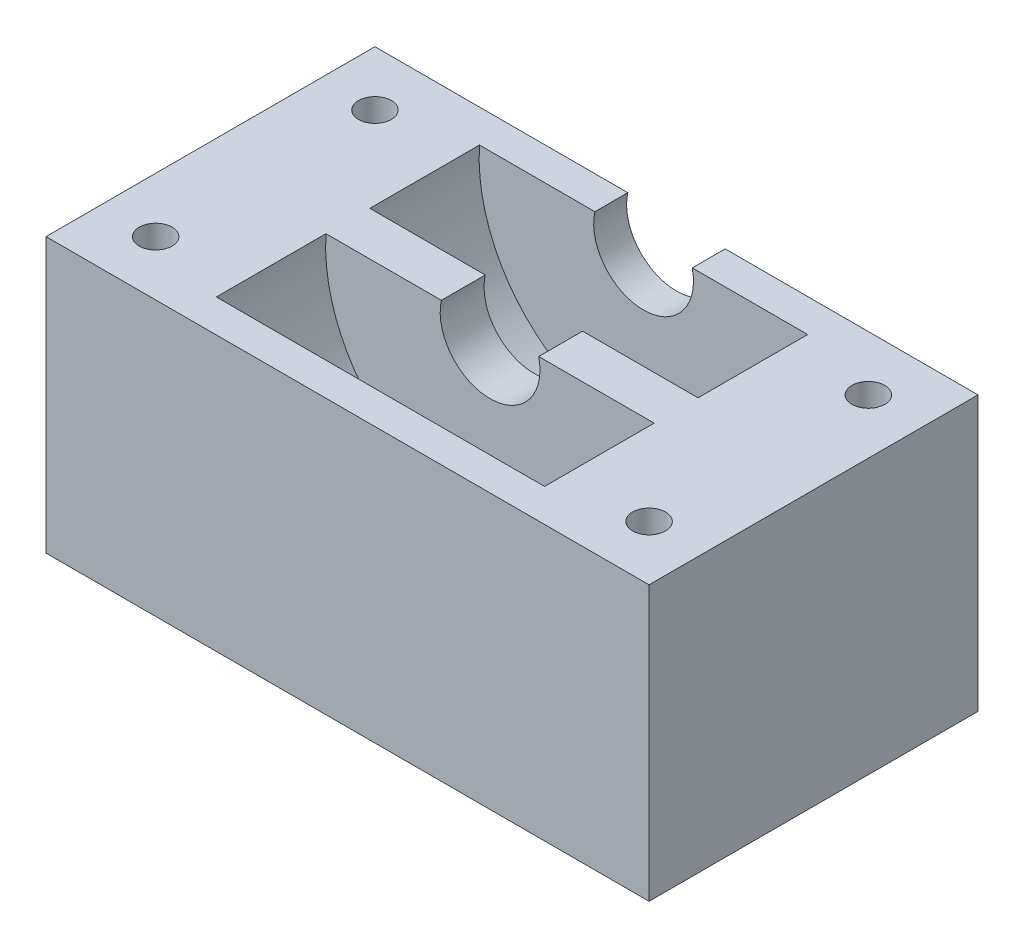
ISO-10303-21;
HEADER;
FILE_DESCRIPTION(('STEP AP214'),'2;1');
FILE_NAME('part.step','',(''),(''),'','','');
FILE_SCHEMA(('AUTOMOTIVE_DESIGN { 1 0 10303 214 1 1 1 1 }'));
ENDSEC;
DATA;
#1=APPLICATION_CONTEXT('core data for automotive mechanical design processes');
#2=APPLICATION_PROTOCOL_DEFINITION('international standard','automotive_design',2000,#1);
#3=PRODUCT_CONTEXT('',#1,'mechanical');
#4=PRODUCT('Part','Part','',(#3));
#5=PRODUCT_RELATED_PRODUCT_CATEGORY('part','',(#4));
#6=PRODUCT_DEFINITION_FORMATION('','',#4);
#7=PRODUCT_DEFINITION_CONTEXT('part definition',#1,'design');
#8=PRODUCT_DEFINITION('design','',#6,#7);
#9=PRODUCT_DEFINITION_SHAPE('','',#8);
#10=(LENGTH_UNIT() NAMED_UNIT(*) SI_UNIT(.MILLI.,.METRE.));
#11=(NAMED_UNIT(*) PLANE_ANGLE_UNIT() SI_UNIT($,.RADIAN.));
#12=(NAMED_UNIT(*) SI_UNIT($,.STERADIAN.) SOLID_ANGLE_UNIT());
#13=UNCERTAINTY_MEASURE_WITH_UNIT(LENGTH_MEASURE(1.E-05),#10,'distance_accuracy_value','');
#14=(GEOMETRIC_REPRESENTATION_CONTEXT(3) GLOBAL_UNCERTAINTY_ASSIGNED_CONTEXT((#13)) GLOBAL_UNIT_ASSIGNED_CONTEXT((#10,
#11,#12)) REPRESENTATION_CONTEXT('',''));
#15=CARTESIAN_POINT('',(0.,0.,0.));
#16=DIRECTION('',(0.,0.,1.));
#17=DIRECTION('',(1.,0.,0.));
#18=AXIS2_PLACEMENT_3D('',#15,#16,#17);
#19=CARTESIAN_POINT('',(-22.5,-17.5,-15.));
#20=DIRECTION('',(0.,1.,0.));
#21=DIRECTION('',(0.,0.,1.));
#22=AXIS2_PLACEMENT_3D('',#19,#20,#21);
#23=CYLINDRICAL_SURFACE('',#22,1.5);
#24=CARTESIAN_POINT('',(-22.5,0.999999999999994,-15.));
#25=DIRECTION('',(0.,-1.,0.));
#26=DIRECTION('',(0.,0.,-1.));
#27=AXIS2_PLACEMENT_3D('',#24,#25,#26);
#28=CIRCLE('',#27,1.5);
#29=CARTESIAN_POINT('',(-22.5,0.999999999999994,-16.5));
#30=VERTEX_POINT('',#29);
#31=EDGE_CURVE('E310',#30,#30,#28,.F.);
#32=ORIENTED_EDGE('',*,*,#31,.T.);
#33=EDGE_LOOP('',(#32));
#34=FACE_BOUND('',#33,.T.);
#35=CARTESIAN_POINT('',(-22.5,-4.,-15.));
#36=DIRECTION('',(0.,-1.,0.));
#37=DIRECTION('',(0.,0.,-1.));
#38=AXIS2_PLACEMENT_3D('',#35,#36,#37);
#39=CIRCLE('',#38,1.5);
#40=CARTESIAN_POINT('',(-22.5,-4.,-16.5));
#41=VERTEX_POINT('',#40);
#42=EDGE_CURVE('E73',#41,#41,#39,.F.);
#43=ORIENTED_EDGE('',*,*,#42,.F.);
#44=EDGE_LOOP('',(#43));
#45=FACE_BOUND('',#44,.T.);
#46=ADVANCED_FACE('F69',(#34,#45),#23,.F.);
#47=CARTESIAN_POINT('',(-22.5,-17.5,5.));
#48=DIRECTION('',(0.,1.,0.));
#49=DIRECTION('',(0.,0.,1.));
#50=AXIS2_PLACEMENT_3D('',#47,#48,#49);
#51=CYLINDRICAL_SURFACE('',#50,1.5);
#52=CARTESIAN_POINT('',(-22.5,0.999999999999994,5.));
#53=DIRECTION('',(0.,-1.,0.));
#54=DIRECTION('',(0.,0.,-1.));
#55=AXIS2_PLACEMENT_3D('',#52,#53,#54);
#56=CIRCLE('',#55,1.5);
#57=CARTESIAN_POINT('',(-22.5,0.999999999999994,3.5));
#58=VERTEX_POINT('',#57);
#59=EDGE_CURVE('E306',#58,#58,#56,.F.);
#60=ORIENTED_EDGE('',*,*,#59,.T.);
#61=EDGE_LOOP('',(#60));
#62=FACE_BOUND('',#61,.T.);
#63=CARTESIAN_POINT('',(-22.5,-4.,5.));
#64=DIRECTION('',(0.,-1.,0.));
#65=DIRECTION('',(0.,0.,-1.));
#66=AXIS2_PLACEMENT_3D('',#63,#64,#65);
#67=CIRCLE('',#66,1.5);
#68=CARTESIAN_POINT('',(-22.5,-4.,3.5));
#69=VERTEX_POINT('',#68);
#70=EDGE_CURVE('E206',#69,#69,#67,.F.);
#71=ORIENTED_EDGE('',*,*,#70,.F.);
#72=EDGE_LOOP('',(#71));
#73=FACE_BOUND('',#72,.T.);
#74=ADVANCED_FACE('F218',(#62,#73),#51,.F.);
#75=CARTESIAN_POINT('',(22.5,-17.5,5.));
#76=DIRECTION('',(0.,1.,0.));
#77=DIRECTION('',(0.,0.,1.));
#78=AXIS2_PLACEMENT_3D('',#75,#76,#77);
#79=CYLINDRICAL_SURFACE('',#78,1.5);
#80=CARTESIAN_POINT('',(22.5,0.999999999999994,5.));
#81=DIRECTION('',(0.,-1.,0.));
#82=DIRECTION('',(0.,0.,-1.));
#83=AXIS2_PLACEMENT_3D('',#80,#81,#82);
#84=CIRCLE('',#83,1.5);
#85=CARTESIAN_POINT('',(22.5,0.999999999999994,3.5));
#86=VERTEX_POINT('',#85);
#87=EDGE_CURVE('E302',#86,#86,#84,.F.);
#88=ORIENTED_EDGE('',*,*,#87,.T.);
#89=EDGE_LOOP('',(#88));
#90=FACE_BOUND('',#89,.T.);
#91=CARTESIAN_POINT('',(22.5,-4.,5.));
#92=DIRECTION('',(0.,-1.,0.));
#93=DIRECTION('',(0.,0.,-1.));
#94=AXIS2_PLACEMENT_3D('',#91,#92,#93);
#95=CIRCLE('',#94,1.5);
#96=CARTESIAN_POINT('',(22.5,-4.,3.5));
#97=VERTEX_POINT('',#96);
#98=EDGE_CURVE('E202',#97,#97,#95,.F.);
#99=ORIENTED_EDGE('',*,*,#98,.F.);
#100=EDGE_LOOP('',(#99));
#101=FACE_BOUND('',#100,.T.);
#102=ADVANCED_FACE('F225',(#90,#101),#79,.F.);
#103=CARTESIAN_POINT('',(22.5,-17.5,-15.));
#104=DIRECTION('',(0.,1.,0.));
#105=DIRECTION('',(0.,0.,1.));
#106=AXIS2_PLACEMENT_3D('',#103,#104,#105);
#107=CYLINDRICAL_SURFACE('',#106,1.5);
#108=CARTESIAN_POINT('',(22.5,0.999999999999994,-15.));
#109=DIRECTION('',(0.,-1.,0.));
#110=DIRECTION('',(0.,0.,-1.));
#111=AXIS2_PLACEMENT_3D('',#108,#109,#110);
#112=CIRCLE('',#111,1.5);
#113=CARTESIAN_POINT('',(22.5,0.999999999999994,-16.5));
#114=VERTEX_POINT('',#113);
#115=EDGE_CURVE('E296',#114,#114,#112,.F.);
#116=ORIENTED_EDGE('',*,*,#115,.T.);
#117=EDGE_LOOP('',(#116));
#118=FACE_BOUND('',#117,.T.);
#119=CARTESIAN_POINT('',(22.5,-4.,-15.));
#120=DIRECTION('',(0.,-1.,0.));
#121=DIRECTION('',(0.,0.,-1.));
#122=AXIS2_PLACEMENT_3D('',#119,#120,#121);
#123=CIRCLE('',#122,1.5);
#124=CARTESIAN_POINT('',(22.5,-4.,-16.5));
#125=VERTEX_POINT('',#124);
#126=EDGE_CURVE('E198',#125,#125,#123,.F.);
#127=ORIENTED_EDGE('',*,*,#126,.F.);
#128=EDGE_LOOP('',(#127));
#129=FACE_BOUND('',#128,.T.);
#130=ADVANCED_FACE('F231',(#118,#129),#107,.F.);
#131=CARTESIAN_POINT('',(0.,0.,10.));
#132=DIRECTION('',(0.,0.,-1.));
#133=DIRECTION('',(-1.,0.,0.));
#134=AXIS2_PLACEMENT_3D('',#131,#132,#133);
#135=CYLINDRICAL_SURFACE('',#134,15.);
#136=DIRECTION('',(0.,0.,-1.));
#137=VECTOR('',#136,1.);
#138=CARTESIAN_POINT('',(-14.9666295470958,0.999999999999994,10.));
#139=LINE('',#138,#137);
#140=CARTESIAN_POINT('',(-14.9666295470958,0.999999999999994,7.));
#141=VERTEX_POINT('',#140);
#142=CARTESIAN_POINT('',(-14.9666295470958,0.999999999999994,-3.));
#143=VERTEX_POINT('',#142);
#144=EDGE_CURVE('E343',#141,#143,#139,.T.);
#145=ORIENTED_EDGE('',*,*,#144,.F.);
#146=CARTESIAN_POINT('',(0.,0.,7.));
#147=DIRECTION('',(0.,0.,1.));
#148=DIRECTION('',(1.,0.,0.));
#149=AXIS2_PLACEMENT_3D('',#146,#147,#148);
#150=CIRCLE('',#149,15.);
#151=CARTESIAN_POINT('',(14.9666295470958,0.999999999999994,7.));
#152=VERTEX_POINT('',#151);
#153=EDGE_CURVE('E196',#141,#152,#150,.T.);
#154=ORIENTED_EDGE('',*,*,#153,.T.);
#155=DIRECTION('',(0.,0.,-1.));
#156=VECTOR('',#155,1.);
#157=CARTESIAN_POINT('',(14.9666295470958,0.999999999999994,10.));
#158=LINE('',#157,#156);
#159=CARTESIAN_POINT('',(14.9666295470958,0.999999999999994,-3.));
#160=VERTEX_POINT('',#159);
#161=EDGE_CURVE('E335',#160,#152,#158,.F.);
#162=ORIENTED_EDGE('',*,*,#161,.F.);
#163=CARTESIAN_POINT('',(0.,0.,-3.));
#164=DIRECTION('',(0.,0.,1.));
#165=DIRECTION('',(1.,0.,0.));
#166=AXIS2_PLACEMENT_3D('',#163,#164,#165);
#167=CIRCLE('',#166,15.);
#168=EDGE_CURVE('E191',#143,#160,#167,.T.);
#169=ORIENTED_EDGE('',*,*,#168,.F.);
#170=EDGE_LOOP('',(#145,#154,#162,#169));
#171=FACE_BOUND('',#170,.T.);
#172=ADVANCED_FACE('F240',(#171),#135,.F.);
#173=CARTESIAN_POINT('',(0.,0.,-20.));
#174=DIRECTION('',(0.,0.,1.));
#175=DIRECTION('',(1.,0.,0.));
#176=AXIS2_PLACEMENT_3D('',#173,#174,#175);
#177=CYLINDRICAL_SURFACE('',#176,15.);
#178=DIRECTION('',(0.,0.,1.));
#179=VECTOR('',#178,1.);
#180=CARTESIAN_POINT('',(14.9666295470958,0.999999999999994,-20.));
#181=LINE('',#180,#179);
#182=CARTESIAN_POINT('',(14.9666295470958,0.999999999999994,-17.));
#183=VERTEX_POINT('',#182);
#184=CARTESIAN_POINT('',(14.9666295470958,0.999999999999994,-7.));
#185=VERTEX_POINT('',#184);
#186=EDGE_CURVE('E320',#183,#185,#181,.T.);
#187=ORIENTED_EDGE('',*,*,#186,.F.);
#188=CARTESIAN_POINT('',(0.,0.,-17.));
#189=DIRECTION('',(0.,0.,-1.));
#190=DIRECTION('',(-1.,0.,0.));
#191=AXIS2_PLACEMENT_3D('',#188,#189,#190);
#192=CIRCLE('',#191,15.);
#193=CARTESIAN_POINT('',(-14.9666295470958,0.999999999999994,-17.));
#194=VERTEX_POINT('',#193);
#195=EDGE_CURVE('E275',#183,#194,#192,.T.);
#196=ORIENTED_EDGE('',*,*,#195,.T.);
#197=DIRECTION('',(0.,0.,1.));
#198=VECTOR('',#197,1.);
#199=CARTESIAN_POINT('',(-14.9666295470958,0.999999999999994,-20.));
#200=LINE('',#199,#198);
#201=CARTESIAN_POINT('',(-14.9666295470958,0.999999999999994,-7.));
#202=VERTEX_POINT('',#201);
#203=EDGE_CURVE('E350',#202,#194,#200,.F.);
#204=ORIENTED_EDGE('',*,*,#203,.F.);
#205=CARTESIAN_POINT('',(0.,0.,-7.));
#206=DIRECTION('',(0.,0.,-1.));
#207=DIRECTION('',(-1.,0.,0.));
#208=AXIS2_PLACEMENT_3D('',#205,#206,#207);
#209=CIRCLE('',#208,15.);
#210=EDGE_CURVE('E186',#185,#202,#209,.T.);
#211=ORIENTED_EDGE('',*,*,#210,.F.);
#212=EDGE_LOOP('',(#187,#196,#204,#211));
#213=FACE_BOUND('',#212,.T.);
#214=ADVANCED_FACE('F236',(#213),#177,.F.);
#215=CARTESIAN_POINT('',(0.,0.,-20.));
#216=DIRECTION('',(0.,0.,1.));
#217=DIRECTION('',(1.,0.,0.));
#218=AXIS2_PLACEMENT_3D('',#215,#216,#217);
#219=CYLINDRICAL_SURFACE('',#218,4.55);
#220=CARTESIAN_POINT('',(0.,0.,-3.));
#221=DIRECTION('',(0.,0.,1.));
#222=DIRECTION('',(1.,0.,0.));
#223=AXIS2_PLACEMENT_3D('',#220,#221,#222);
#224=CIRCLE('',#223,4.55);
#225=CARTESIAN_POINT('',(4.43874982399324,0.999999999999994,-3.));
#226=VERTEX_POINT('',#225);
#227=CARTESIAN_POINT('',(-4.43874982399324,0.999999999999994,-3.));
#228=VERTEX_POINT('',#227);
#229=EDGE_CURVE('E187',#226,#228,#224,.F.);
#230=ORIENTED_EDGE('',*,*,#229,.F.);
#231=DIRECTION('',(0.,0.,1.));
#232=VECTOR('',#231,1.);
#233=CARTESIAN_POINT('',(4.43874982399324,0.999999999999994,-20.));
#234=LINE('',#233,#232);
#235=CARTESIAN_POINT('',(4.43874982399324,0.999999999999994,-7.));
#236=VERTEX_POINT('',#235);
#237=EDGE_CURVE('E327',#226,#236,#234,.F.);
#238=ORIENTED_EDGE('',*,*,#237,.T.);
#239=CARTESIAN_POINT('',(0.,0.,-7.));
#240=DIRECTION('',(0.,0.,-1.));
#241=DIRECTION('',(-1.,0.,0.));
#242=AXIS2_PLACEMENT_3D('',#239,#240,#241);
#243=CIRCLE('',#242,4.55);
#244=CARTESIAN_POINT('',(-4.43874982399324,0.999999999999994,-7.));
#245=VERTEX_POINT('',#244);
#246=EDGE_CURVE('E182',#245,#236,#243,.F.);
#247=ORIENTED_EDGE('',*,*,#246,.F.);
#248=DIRECTION('',(0.,0.,1.));
#249=VECTOR('',#248,1.);
#250=CARTESIAN_POINT('',(-4.43874982399324,0.999999999999994,-20.));
#251=LINE('',#250,#249);
#252=EDGE_CURVE('E346',#245,#228,#251,.T.);
#253=ORIENTED_EDGE('',*,*,#252,.T.);
#254=EDGE_LOOP('',(#230,#238,#247,#253));
#255=FACE_BOUND('',#254,.T.);
#256=ADVANCED_FACE('F232',(#255),#219,.F.);
#257=CARTESIAN_POINT('',(0.,0.,-7.));
#258=DIRECTION('',(0.,0.,-1.));
#259=DIRECTION('',(-1.,0.,0.));
#260=AXIS2_PLACEMENT_3D('',#257,#258,#259);
#261=PLANE('',#260);
#262=DIRECTION('',(-1.,0.,0.));
#263=VECTOR('',#262,1.);
#264=CARTESIAN_POINT('',(0.,0.999999999999994,-7.));
#265=LINE('',#264,#263);
#266=EDGE_CURVE('E324',#185,#236,#265,.T.);
#267=ORIENTED_EDGE('',*,*,#266,.F.);
#268=ORIENTED_EDGE('',*,*,#210,.T.);
#269=EDGE_CURVE('E328',#245,#202,#265,.T.);
#270=ORIENTED_EDGE('',*,*,#269,.F.);
#271=ORIENTED_EDGE('',*,*,#246,.T.);
#272=EDGE_LOOP('',(#267,#268,#270,#271));
#273=FACE_BOUND('',#272,.T.);
#274=ADVANCED_FACE('F235',(#273),#261,.T.);
#275=CARTESIAN_POINT('',(0.,0.,-3.));
#276=DIRECTION('',(0.,0.,1.));
#277=DIRECTION('',(1.,0.,0.));
#278=AXIS2_PLACEMENT_3D('',#275,#276,#277);
#279=PLANE('',#278);
#280=DIRECTION('',(1.,0.,0.));
#281=VECTOR('',#280,1.);
#282=CARTESIAN_POINT('',(0.,0.999999999999994,-3.));
#283=LINE('',#282,#281);
#284=EDGE_CURVE('E336',#143,#228,#283,.T.);
#285=ORIENTED_EDGE('',*,*,#284,.F.);
#286=ORIENTED_EDGE('',*,*,#168,.T.);
#287=EDGE_CURVE('E332',#226,#160,#283,.T.);
#288=ORIENTED_EDGE('',*,*,#287,.F.);
#289=ORIENTED_EDGE('',*,*,#229,.T.);
#290=EDGE_LOOP('',(#285,#286,#288,#289));
#291=FACE_BOUND('',#290,.T.);
#292=ADVANCED_FACE('F382',(#291),#279,.T.);
#293=CARTESIAN_POINT('',(0.,0.,-17.));
#294=DIRECTION('',(0.,0.,-1.));
#295=DIRECTION('',(-1.,0.,0.));
#296=AXIS2_PLACEMENT_3D('',#293,#294,#295);
#297=PLANE('',#296);
#298=ORIENTED_EDGE('',*,*,#195,.F.);
#299=DIRECTION('',(-1.,0.,0.));
#300=VECTOR('',#299,1.);
#301=CARTESIAN_POINT('',(0.,0.999999999999994,-17.));
#302=LINE('',#301,#300);
#303=CARTESIAN_POINT('',(4.43874982399324,0.999999999999994,-17.));
#304=VERTEX_POINT('',#303);
#305=EDGE_CURVE('E316',#183,#304,#302,.T.);
#306=ORIENTED_EDGE('',*,*,#305,.T.);
#307=CARTESIAN_POINT('',(0.,0.,-17.));
#308=DIRECTION('',(0.,0.,-1.));
#309=DIRECTION('',(-1.,0.,0.));
#310=AXIS2_PLACEMENT_3D('',#307,#308,#309);
#311=CIRCLE('',#310,4.55);
#312=CARTESIAN_POINT('',(-4.43874982399324,0.999999999999994,-17.));
#313=VERTEX_POINT('',#312);
#314=EDGE_CURVE('E192',#304,#313,#311,.T.);
#315=ORIENTED_EDGE('',*,*,#314,.T.);
#316=EDGE_CURVE('E321',#313,#194,#302,.T.);
#317=ORIENTED_EDGE('',*,*,#316,.T.);
#318=EDGE_LOOP('',(#298,#306,#315,#317));
#319=FACE_BOUND('',#318,.T.);
#320=ADVANCED_FACE('F369',(#319),#297,.F.);
#321=CARTESIAN_POINT('',(0.,0.,7.));
#322=DIRECTION('',(0.,0.,1.));
#323=DIRECTION('',(1.,0.,0.));
#324=AXIS2_PLACEMENT_3D('',#321,#322,#323);
#325=PLANE('',#324);
#326=ORIENTED_EDGE('',*,*,#153,.F.);
#327=DIRECTION('',(1.,0.,0.));
#328=VECTOR('',#327,1.);
#329=CARTESIAN_POINT('',(0.,0.999999999999994,7.));
#330=LINE('',#329,#328);
#331=EDGE_CURVE('E339',#141,#152,#330,.T.);
#332=ORIENTED_EDGE('',*,*,#331,.T.);
#333=EDGE_LOOP('',(#326,#332));
#334=FACE_BOUND('',#333,.T.);
#335=ADVANCED_FACE('F386',(#334),#325,.F.);
#336=CARTESIAN_POINT('',(0.,0.,0.));
#337=DIRECTION('',(0.,0.,-1.));
#338=DIRECTION('',(-1.,0.,0.));
#339=AXIS2_PLACEMENT_3D('',#336,#337,#338);
#340=CYLINDRICAL_SURFACE('',#339,4.55);
#341=CARTESIAN_POINT('',(0.,0.,-20.));
#342=DIRECTION('',(0.,0.,-1.));
#343=DIRECTION('',(-1.,0.,0.));
#344=AXIS2_PLACEMENT_3D('',#341,#342,#343);
#345=CIRCLE('',#344,4.55);
#346=CARTESIAN_POINT('',(4.43874982399324,0.999999999999994,-20.));
#347=VERTEX_POINT('',#346);
#348=CARTESIAN_POINT('',(-4.43874982399324,0.999999999999994,-20.));
#349=VERTEX_POINT('',#348);
#350=EDGE_CURVE('E197',#347,#349,#345,.T.);
#351=ORIENTED_EDGE('',*,*,#350,.T.);
#352=DIRECTION('',(0.,0.,-1.));
#353=VECTOR('',#352,1.);
#354=CARTESIAN_POINT('',(-4.43874982399324,0.999999999999994,0.));
#355=LINE('',#354,#353);
#356=EDGE_CURVE('E353',#349,#313,#355,.F.);
#357=ORIENTED_EDGE('',*,*,#356,.T.);
#358=ORIENTED_EDGE('',*,*,#314,.F.);
#359=DIRECTION('',(0.,0.,-1.));
#360=VECTOR('',#359,1.);
#361=CARTESIAN_POINT('',(4.43874982399324,0.999999999999994,0.));
#362=LINE('',#361,#360);
#363=EDGE_CURVE('E313',#304,#347,#362,.T.);
#364=ORIENTED_EDGE('',*,*,#363,.T.);
#365=EDGE_LOOP('',(#351,#357,#358,#364));
#366=FACE_BOUND('',#365,.T.);
#367=ADVANCED_FACE('F245',(#366),#340,.F.);
#368=CARTESIAN_POINT('',(0.,0.,-20.));
#369=DIRECTION('',(0.,0.,-1.));
#370=DIRECTION('',(-1.,0.,0.));
#371=AXIS2_PLACEMENT_3D('',#368,#369,#370);
#372=PLANE('',#371);
#373=DIRECTION('',(-1.,0.,0.));
#374=VECTOR('',#373,1.);
#375=CARTESIAN_POINT('',(-27.5,0.999999999999994,-20.));
#376=LINE('',#375,#374);
#377=CARTESIAN_POINT('',(27.5,0.999999999999994,-20.));
#378=VERTEX_POINT('',#377);
#379=EDGE_CURVE('E290',#378,#347,#376,.T.);
#380=ORIENTED_EDGE('',*,*,#379,.F.);
#381=DIRECTION('',(0.,-1.,0.));
#382=VECTOR('',#381,1.);
#383=CARTESIAN_POINT('',(27.5,26.,-20.));
#384=LINE('',#383,#382);
#385=CARTESIAN_POINT('',(27.5,-24.,-20.));
#386=VERTEX_POINT('',#385);
#387=EDGE_CURVE('E167',#378,#386,#384,.T.);
#388=ORIENTED_EDGE('',*,*,#387,.T.);
#389=DIRECTION('',(1.,0.,0.));
#390=VECTOR('',#389,1.);
#391=CARTESIAN_POINT('',(17.5,-24.,-20.));
#392=LINE('',#391,#390);
#393=CARTESIAN_POINT('',(-27.5,-24.,-20.));
#394=VERTEX_POINT('',#393);
#395=EDGE_CURVE('E270',#394,#386,#392,.T.);
#396=ORIENTED_EDGE('',*,*,#395,.F.);
#397=DIRECTION('',(0.,1.,0.));
#398=VECTOR('',#397,1.);
#399=CARTESIAN_POINT('',(-27.5,21.,-20.));
#400=LINE('',#399,#398);
#401=CARTESIAN_POINT('',(-27.5,0.999999999999994,-20.));
#402=VERTEX_POINT('',#401);
#403=EDGE_CURVE('E178',#394,#402,#400,.T.);
#404=ORIENTED_EDGE('',*,*,#403,.T.);
#405=EDGE_CURVE('E169',#349,#402,#376,.T.);
#406=ORIENTED_EDGE('',*,*,#405,.F.);
#407=ORIENTED_EDGE('',*,*,#350,.F.);
#408=EDGE_LOOP('',(#380,#388,#396,#404,#406,#407));
#409=FACE_BOUND('',#408,.T.);
#410=ADVANCED_FACE('F242',(#409),#372,.T.);
#411=CARTESIAN_POINT('',(27.5,0.,10.));
#412=DIRECTION('',(1.,0.,0.));
#413=DIRECTION('',(0.,0.,-1.));
#414=AXIS2_PLACEMENT_3D('',#411,#412,#413);
#415=PLANE('',#414);
#416=DIRECTION('',(0.,0.,-1.));
#417=VECTOR('',#416,1.);
#418=CARTESIAN_POINT('',(27.5,0.999999999999994,10.));
#419=LINE('',#418,#417);
#420=CARTESIAN_POINT('',(27.5,0.999999999999994,10.));
#421=VERTEX_POINT('',#420);
#422=EDGE_CURVE('E160',#421,#378,#419,.T.);
#423=ORIENTED_EDGE('',*,*,#422,.F.);
#424=DIRECTION('',(0.,-1.,0.));
#425=VECTOR('',#424,1.);
#426=CARTESIAN_POINT('',(27.5,0.,10.));
#427=LINE('',#426,#425);
#428=CARTESIAN_POINT('',(27.5,-24.,10.));
#429=VERTEX_POINT('',#428);
#430=EDGE_CURVE('E79',#421,#429,#427,.T.);
#431=ORIENTED_EDGE('',*,*,#430,.T.);
#432=DIRECTION('',(0.,0.,1.));
#433=VECTOR('',#432,1.);
#434=CARTESIAN_POINT('',(27.5,-24.,-20.));
#435=LINE('',#434,#433);
#436=EDGE_CURVE('E268',#386,#429,#435,.T.);
#437=ORIENTED_EDGE('',*,*,#436,.F.);
#438=ORIENTED_EDGE('',*,*,#387,.F.);
#439=EDGE_LOOP('',(#423,#431,#437,#438));
#440=FACE_BOUND('',#439,.T.);
#441=ADVANCED_FACE('F71',(#440),#415,.T.);
#442=CARTESIAN_POINT('',(0.,-24.,0.));
#443=DIRECTION('',(0.,-1.,0.));
#444=DIRECTION('',(0.,0.,-1.));
#445=AXIS2_PLACEMENT_3D('',#442,#443,#444);
#446=PLANE('',#445);
#447=CARTESIAN_POINT('',(-22.5,-24.,-15.));
#448=DIRECTION('',(0.,-1.,0.));
#449=DIRECTION('',(0.,0.,-1.));
#450=AXIS2_PLACEMENT_3D('',#447,#448,#449);
#451=CIRCLE('',#450,3.);
#452=CARTESIAN_POINT('',(-22.5,-24.,-18.));
#453=VERTEX_POINT('',#452);
#454=EDGE_CURVE('E470',#453,#453,#451,.T.);
#455=ORIENTED_EDGE('',*,*,#454,.F.);
#456=EDGE_LOOP('',(#455));
#457=FACE_BOUND('',#456,.T.);
#458=CARTESIAN_POINT('',(22.5,-24.,5.));
#459=DIRECTION('',(0.,-1.,0.));
#460=DIRECTION('',(0.,0.,-1.));
#461=AXIS2_PLACEMENT_3D('',#458,#459,#460);
#462=CIRCLE('',#461,3.);
#463=CARTESIAN_POINT('',(22.5,-24.,2.));
#464=VERTEX_POINT('',#463);
#465=EDGE_CURVE('E485',#464,#464,#462,.T.);
#466=ORIENTED_EDGE('',*,*,#465,.F.);
#467=EDGE_LOOP('',(#466));
#468=FACE_BOUND('',#467,.T.);
#469=CARTESIAN_POINT('',(22.5,-24.,-15.));
#470=DIRECTION('',(0.,-1.,0.));
#471=DIRECTION('',(0.,0.,-1.));
#472=AXIS2_PLACEMENT_3D('',#469,#470,#471);
#473=CIRCLE('',#472,3.);
#474=CARTESIAN_POINT('',(22.5,-24.,-18.));
#475=VERTEX_POINT('',#474);
#476=EDGE_CURVE('E480',#475,#475,#473,.T.);
#477=ORIENTED_EDGE('',*,*,#476,.F.);
#478=EDGE_LOOP('',(#477));
#479=FACE_BOUND('',#478,.T.);
#480=CARTESIAN_POINT('',(-22.5,-24.,5.));
#481=DIRECTION('',(0.,-1.,0.));
#482=DIRECTION('',(0.,0.,-1.));
#483=AXIS2_PLACEMENT_3D('',#480,#481,#482);
#484=CIRCLE('',#483,3.);
#485=CARTESIAN_POINT('',(-22.5,-24.,2.));
#486=VERTEX_POINT('',#485);
#487=EDGE_CURVE('E469',#486,#486,#484,.T.);
#488=ORIENTED_EDGE('',*,*,#487,.F.);
#489=EDGE_LOOP('',(#488));
#490=FACE_BOUND('',#489,.T.);
#491=DIRECTION('',(-1.,0.,0.));
#492=VECTOR('',#491,1.);
#493=CARTESIAN_POINT('',(27.5,-24.,10.));
#494=LINE('',#493,#492);
#495=CARTESIAN_POINT('',(-27.5,-24.,10.));
#496=VERTEX_POINT('',#495);
#497=EDGE_CURVE('E174',#429,#496,#494,.T.);
#498=ORIENTED_EDGE('',*,*,#497,.T.);
#499=DIRECTION('',(0.,0.,-1.));
#500=VECTOR('',#499,1.);
#501=CARTESIAN_POINT('',(-27.5,-24.,10.));
#502=LINE('',#501,#500);
#503=EDGE_CURVE('E265',#496,#394,#502,.T.);
#504=ORIENTED_EDGE('',*,*,#503,.T.);
#505=ORIENTED_EDGE('',*,*,#395,.T.);
#506=ORIENTED_EDGE('',*,*,#436,.T.);
#507=EDGE_LOOP('',(#498,#504,#505,#506));
#508=FACE_BOUND('',#507,.T.);
#509=ADVANCED_FACE('F253',(#457,#468,#479,#490,#508),#446,.T.);
#510=CARTESIAN_POINT('',(-27.5,0.,10.));
#511=DIRECTION('',(1.,0.,0.));
#512=DIRECTION('',(0.,0.,-1.));
#513=AXIS2_PLACEMENT_3D('',#510,#511,#512);
#514=PLANE('',#513);
#515=DIRECTION('',(0.,-1.,0.));
#516=VECTOR('',#515,1.);
#517=CARTESIAN_POINT('',(-27.5,0.,10.));
#518=LINE('',#517,#516);
#519=CARTESIAN_POINT('',(-27.5,0.999999999999994,10.));
#520=VERTEX_POINT('',#519);
#521=EDGE_CURVE('E12',#520,#496,#518,.T.);
#522=ORIENTED_EDGE('',*,*,#521,.F.);
#523=DIRECTION('',(0.,0.,1.));
#524=VECTOR('',#523,1.);
#525=CARTESIAN_POINT('',(-27.5,0.999999999999994,10.));
#526=LINE('',#525,#524);
#527=EDGE_CURVE('E87',#402,#520,#526,.T.);
#528=ORIENTED_EDGE('',*,*,#527,.F.);
#529=ORIENTED_EDGE('',*,*,#403,.F.);
#530=ORIENTED_EDGE('',*,*,#503,.F.);
#531=EDGE_LOOP('',(#522,#528,#529,#530));
#532=FACE_BOUND('',#531,.T.);
#533=ADVANCED_FACE('F249',(#532),#514,.F.);
#534=CARTESIAN_POINT('',(0.,0.,10.));
#535=DIRECTION('',(0.,0.,1.));
#536=DIRECTION('',(1.,0.,0.));
#537=AXIS2_PLACEMENT_3D('',#534,#535,#536);
#538=PLANE('',#537);
#539=DIRECTION('',(1.,0.,0.));
#540=VECTOR('',#539,1.);
#541=CARTESIAN_POINT('',(27.5,0.999999999999994,10.));
#542=LINE('',#541,#540);
#543=EDGE_CURVE('E158',#520,#421,#542,.T.);
#544=ORIENTED_EDGE('',*,*,#543,.F.);
#545=ORIENTED_EDGE('',*,*,#521,.T.);
#546=ORIENTED_EDGE('',*,*,#497,.F.);
#547=ORIENTED_EDGE('',*,*,#430,.F.);
#548=EDGE_LOOP('',(#544,#545,#546,#547));
#549=FACE_BOUND('',#548,.T.);
#550=ADVANCED_FACE('F172',(#549),#538,.T.);
#551=CARTESIAN_POINT('',(0.,0.999999999999994,0.));
#552=DIRECTION('',(0.,-1.,0.));
#553=DIRECTION('',(0.,0.,-1.));
#554=AXIS2_PLACEMENT_3D('',#551,#552,#553);
#555=PLANE('',#554);
#556=ORIENTED_EDGE('',*,*,#59,.F.);
#557=EDGE_LOOP('',(#556));
#558=FACE_BOUND('',#557,.T.);
#559=ORIENTED_EDGE('',*,*,#115,.F.);
#560=EDGE_LOOP('',(#559));
#561=FACE_BOUND('',#560,.T.);
#562=ORIENTED_EDGE('',*,*,#87,.F.);
#563=EDGE_LOOP('',(#562));
#564=FACE_BOUND('',#563,.T.);
#565=ORIENTED_EDGE('',*,*,#31,.F.);
#566=EDGE_LOOP('',(#565));
#567=FACE_BOUND('',#566,.T.);
#568=ORIENTED_EDGE('',*,*,#405,.T.);
#569=ORIENTED_EDGE('',*,*,#527,.T.);
#570=ORIENTED_EDGE('',*,*,#543,.T.);
#571=ORIENTED_EDGE('',*,*,#422,.T.);
#572=ORIENTED_EDGE('',*,*,#379,.T.);
#573=ORIENTED_EDGE('',*,*,#363,.F.);
#574=ORIENTED_EDGE('',*,*,#305,.F.);
#575=ORIENTED_EDGE('',*,*,#186,.T.);
#576=ORIENTED_EDGE('',*,*,#266,.T.);
#577=ORIENTED_EDGE('',*,*,#237,.F.);
#578=ORIENTED_EDGE('',*,*,#287,.T.);
#579=ORIENTED_EDGE('',*,*,#161,.T.);
#580=ORIENTED_EDGE('',*,*,#331,.F.);
#581=ORIENTED_EDGE('',*,*,#144,.T.);
#582=ORIENTED_EDGE('',*,*,#284,.T.);
#583=ORIENTED_EDGE('',*,*,#252,.F.);
#584=ORIENTED_EDGE('',*,*,#269,.T.);
#585=ORIENTED_EDGE('',*,*,#203,.T.);
#586=ORIENTED_EDGE('',*,*,#316,.F.);
#587=ORIENTED_EDGE('',*,*,#356,.F.);
#588=EDGE_LOOP('',(#568,#569,#570,#571,#572,#573,#574,#575,#576,#577,#578,#579,#580,#581,#582,
#583,#584,#585,#586,#587));
#589=FACE_BOUND('',#588,.T.);
#590=ADVANCED_FACE('F159',(#558,#561,#564,#567,#589),#555,.F.);
#591=CARTESIAN_POINT('',(-22.5,-4.,5.));
#592=DIRECTION('',(0.,-1.,0.));
#593=DIRECTION('',(0.,0.,-1.));
#594=AXIS2_PLACEMENT_3D('',#591,#592,#593);
#595=PLANE('',#594);
#596=CARTESIAN_POINT('',(-22.5,-4.,5.));
#597=DIRECTION('',(0.,-1.,0.));
#598=DIRECTION('',(0.,0.,-1.));
#599=AXIS2_PLACEMENT_3D('',#596,#597,#598);
#600=CIRCLE('',#599,3.);
#601=CARTESIAN_POINT('',(-22.5,-4.,2.));
#602=VERTEX_POINT('',#601);
#603=EDGE_CURVE('E203',#602,#602,#600,.T.);
#604=ORIENTED_EDGE('',*,*,#603,.T.);
#605=EDGE_LOOP('',(#604));
#606=FACE_BOUND('',#605,.T.);
#607=ORIENTED_EDGE('',*,*,#70,.T.);
#608=EDGE_LOOP('',(#607));
#609=FACE_BOUND('',#608,.T.);
#610=ADVANCED_FACE('F433',(#606,#609),#595,.T.);
#611=CARTESIAN_POINT('',(-22.5,-4.,5.));
#612=DIRECTION('',(0.,-1.,0.));
#613=DIRECTION('',(0.,0.,-1.));
#614=AXIS2_PLACEMENT_3D('',#611,#612,#613);
#615=CYLINDRICAL_SURFACE('',#614,3.);
#616=ORIENTED_EDGE('',*,*,#603,.F.);
#617=EDGE_LOOP('',(#616));
#618=FACE_BOUND('',#617,.T.);
#619=ORIENTED_EDGE('',*,*,#487,.T.);
#620=EDGE_LOOP('',(#619));
#621=FACE_BOUND('',#620,.T.);
#622=ADVANCED_FACE('F436',(#618,#621),#615,.F.);
#623=CARTESIAN_POINT('',(22.5,-4.,-15.));
#624=DIRECTION('',(0.,-1.,0.));
#625=DIRECTION('',(0.,0.,-1.));
#626=AXIS2_PLACEMENT_3D('',#623,#624,#625);
#627=PLANE('',#626);
#628=CARTESIAN_POINT('',(22.5,-4.,-15.));
#629=DIRECTION('',(0.,-1.,0.));
#630=DIRECTION('',(0.,0.,-1.));
#631=AXIS2_PLACEMENT_3D('',#628,#629,#630);
#632=CIRCLE('',#631,3.);
#633=CARTESIAN_POINT('',(22.5,-4.,-18.));
#634=VERTEX_POINT('',#633);
#635=EDGE_CURVE('E489',#634,#634,#632,.T.);
#636=ORIENTED_EDGE('',*,*,#635,.T.);
#637=EDGE_LOOP('',(#636));
#638=FACE_BOUND('',#637,.T.);
#639=ORIENTED_EDGE('',*,*,#126,.T.);
#640=EDGE_LOOP('',(#639));
#641=FACE_BOUND('',#640,.T.);
#642=ADVANCED_FACE('F425',(#638,#641),#627,.T.);
#643=CARTESIAN_POINT('',(22.5,-4.,-15.));
#644=DIRECTION('',(0.,-1.,0.));
#645=DIRECTION('',(0.,0.,-1.));
#646=AXIS2_PLACEMENT_3D('',#643,#644,#645);
#647=CYLINDRICAL_SURFACE('',#646,3.);
#648=ORIENTED_EDGE('',*,*,#635,.F.);
#649=EDGE_LOOP('',(#648));
#650=FACE_BOUND('',#649,.T.);
#651=ORIENTED_EDGE('',*,*,#476,.T.);
#652=EDGE_LOOP('',(#651));
#653=FACE_BOUND('',#652,.T.);
#654=ADVANCED_FACE('F416',(#650,#653),#647,.F.);
#655=CARTESIAN_POINT('',(22.5,-4.,5.));
#656=DIRECTION('',(0.,-1.,0.));
#657=DIRECTION('',(0.,0.,-1.));
#658=AXIS2_PLACEMENT_3D('',#655,#656,#657);
#659=PLANE('',#658);
#660=CARTESIAN_POINT('',(22.5,-4.,5.));
#661=DIRECTION('',(0.,-1.,0.));
#662=DIRECTION('',(0.,0.,-1.));
#663=AXIS2_PLACEMENT_3D('',#660,#661,#662);
#664=CIRCLE('',#663,3.);
#665=CARTESIAN_POINT('',(22.5,-4.,2.));
#666=VERTEX_POINT('',#665);
#667=EDGE_CURVE('E477',#666,#666,#664,.T.);
#668=ORIENTED_EDGE('',*,*,#667,.T.);
#669=EDGE_LOOP('',(#668));
#670=FACE_BOUND('',#669,.T.);
#671=ORIENTED_EDGE('',*,*,#98,.T.);
#672=EDGE_LOOP('',(#671));
#673=FACE_BOUND('',#672,.T.);
#674=ADVANCED_FACE('F413',(#670,#673),#659,.T.);
#675=CARTESIAN_POINT('',(22.5,-4.,5.));
#676=DIRECTION('',(0.,-1.,0.));
#677=DIRECTION('',(0.,0.,-1.));
#678=AXIS2_PLACEMENT_3D('',#675,#676,#677);
#679=CYLINDRICAL_SURFACE('',#678,3.);
#680=ORIENTED_EDGE('',*,*,#667,.F.);
#681=EDGE_LOOP('',(#680));
#682=FACE_BOUND('',#681,.T.);
#683=ORIENTED_EDGE('',*,*,#465,.T.);
#684=EDGE_LOOP('',(#683));
#685=FACE_BOUND('',#684,.T.);
#686=ADVANCED_FACE('F415',(#682,#685),#679,.F.);
#687=CARTESIAN_POINT('',(-22.5,-4.,-15.));
#688=DIRECTION('',(0.,-1.,0.));
#689=DIRECTION('',(0.,0.,-1.));
#690=AXIS2_PLACEMENT_3D('',#687,#688,#689);
#691=PLANE('',#690);
#692=CARTESIAN_POINT('',(-22.5,-4.,-15.));
#693=DIRECTION('',(0.,-1.,0.));
#694=DIRECTION('',(0.,0.,-1.));
#695=AXIS2_PLACEMENT_3D('',#692,#693,#694);
#696=CIRCLE('',#695,3.);
#697=CARTESIAN_POINT('',(-22.5,-4.,-18.));
#698=VERTEX_POINT('',#697);
#699=EDGE_CURVE('E467',#698,#698,#696,.T.);
#700=ORIENTED_EDGE('',*,*,#699,.T.);
#701=EDGE_LOOP('',(#700));
#702=FACE_BOUND('',#701,.T.);
#703=ORIENTED_EDGE('',*,*,#42,.T.);
#704=EDGE_LOOP('',(#703));
#705=FACE_BOUND('',#704,.T.);
#706=ADVANCED_FACE('F215',(#702,#705),#691,.T.);
#707=CARTESIAN_POINT('',(-22.5,-4.,-15.));
#708=DIRECTION('',(0.,-1.,0.));
#709=DIRECTION('',(0.,0.,-1.));
#710=AXIS2_PLACEMENT_3D('',#707,#708,#709);
#711=CYLINDRICAL_SURFACE('',#710,3.);
#712=ORIENTED_EDGE('',*,*,#699,.F.);
#713=EDGE_LOOP('',(#712));
#714=FACE_BOUND('',#713,.T.);
#715=ORIENTED_EDGE('',*,*,#454,.T.);
#716=EDGE_LOOP('',(#715));
#717=FACE_BOUND('',#716,.T.);
#718=ADVANCED_FACE('F430',(#714,#717),#711,.F.);
#719=CLOSED_SHELL('',(#46,#74,#102,#130,#172,#214,#256,#274,#292,#320,#335,#367,#410,#441,#509,
#533,#550,#590,#610,#622,#642,#654,#674,#686,#706,#718));
#720=MANIFOLD_SOLID_BREP('B2',#719);
#721=ADVANCED_BREP_SHAPE_REPRESENTATION('',(#18,#720),#14);
#722=SHAPE_DEFINITION_REPRESENTATION(#9,#721);
ENDSEC;
END-ISO-10303-21;
